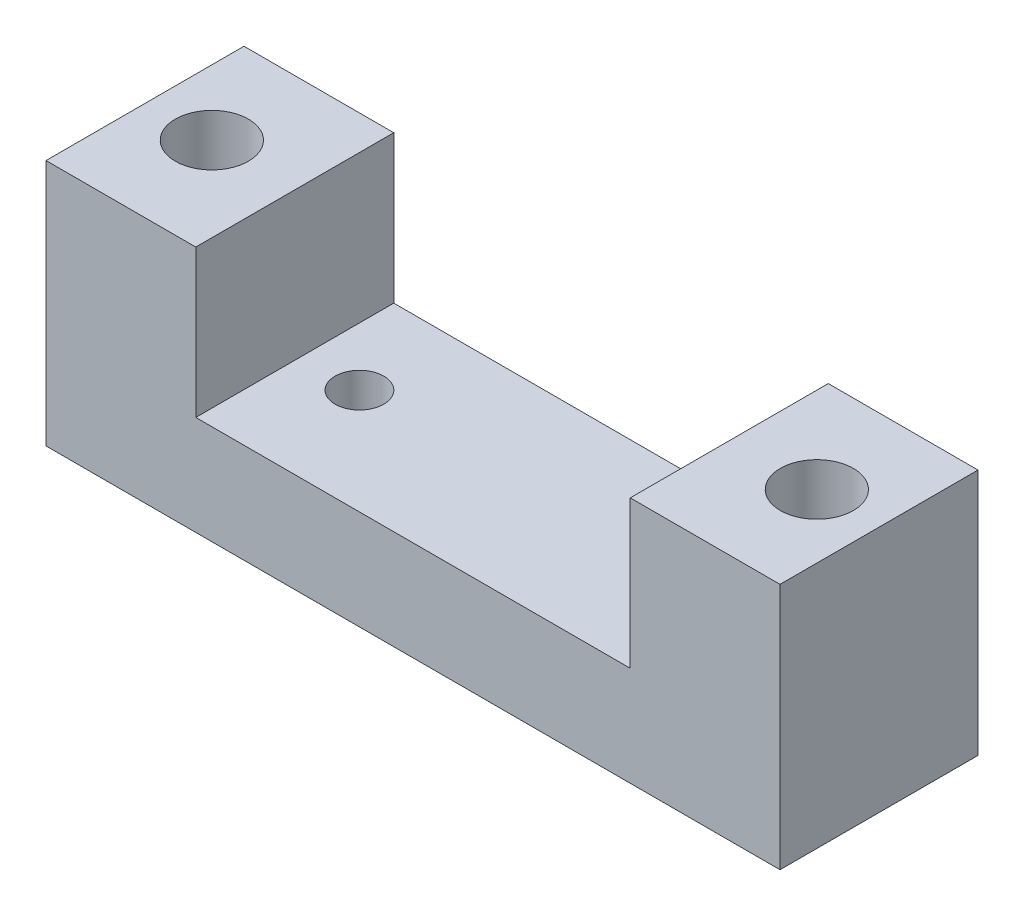
ISO-10303-21;
HEADER;
FILE_DESCRIPTION(('STEP AP214'),'2;1');
FILE_NAME('part.step','',(''),(''),'','','');
FILE_SCHEMA(('AUTOMOTIVE_DESIGN { 1 0 10303 214 1 1 1 1 }'));
ENDSEC;
DATA;
#1=APPLICATION_CONTEXT('core data for automotive mechanical design processes');
#2=APPLICATION_PROTOCOL_DEFINITION('international standard','automotive_design',2000,#1);
#3=PRODUCT_CONTEXT('',#1,'mechanical');
#4=PRODUCT('Part','Part','',(#3));
#5=PRODUCT_RELATED_PRODUCT_CATEGORY('part','',(#4));
#6=PRODUCT_DEFINITION_FORMATION('','',#4);
#7=PRODUCT_DEFINITION_CONTEXT('part definition',#1,'design');
#8=PRODUCT_DEFINITION('design','',#6,#7);
#9=PRODUCT_DEFINITION_SHAPE('','',#8);
#10=(LENGTH_UNIT() NAMED_UNIT(*) SI_UNIT(.MILLI.,.METRE.));
#11=(NAMED_UNIT(*) PLANE_ANGLE_UNIT() SI_UNIT($,.RADIAN.));
#12=(NAMED_UNIT(*) SI_UNIT($,.STERADIAN.) SOLID_ANGLE_UNIT());
#13=UNCERTAINTY_MEASURE_WITH_UNIT(LENGTH_MEASURE(1.E-05),#10,'distance_accuracy_value','');
#14=(GEOMETRIC_REPRESENTATION_CONTEXT(3) GLOBAL_UNCERTAINTY_ASSIGNED_CONTEXT((#13)) GLOBAL_UNIT_ASSIGNED_CONTEXT((#10,
#11,#12)) REPRESENTATION_CONTEXT('',''));
#15=CARTESIAN_POINT('',(0.,0.,0.));
#16=DIRECTION('',(0.,0.,1.));
#17=DIRECTION('',(1.,0.,0.));
#18=AXIS2_PLACEMENT_3D('',#15,#16,#17);
#19=CARTESIAN_POINT('',(15.07,0.,8.13));
#20=DIRECTION('',(0.,1.,0.));
#21=DIRECTION('',(0.,0.,1.));
#22=AXIS2_PLACEMENT_3D('',#19,#20,#21);
#23=PLANE('',#22);
#24=CARTESIAN_POINT('',(-6.53,0.,3.8));
#25=DIRECTION('',(0.,1.,0.));
#26=DIRECTION('',(0.,0.,1.));
#27=AXIS2_PLACEMENT_3D('',#24,#25,#26);
#28=CIRCLE('',#27,0.999999999999994);
#29=CARTESIAN_POINT('',(-6.53,0.,4.79999999999999));
#30=VERTEX_POINT('',#29);
#31=EDGE_CURVE('E219',#30,#30,#28,.T.);
#32=ORIENTED_EDGE('',*,*,#31,.T.);
#33=EDGE_LOOP('',(#32));
#34=FACE_BOUND('',#33,.T.);
#35=CARTESIAN_POINT('',(6.53,0.,3.8));
#36=DIRECTION('',(0.,1.,0.));
#37=DIRECTION('',(0.,0.,1.));
#38=AXIS2_PLACEMENT_3D('',#35,#36,#37);
#39=CIRCLE('',#38,0.999999999999994);
#40=CARTESIAN_POINT('',(6.53,0.,4.79999999999999));
#41=VERTEX_POINT('',#40);
#42=EDGE_CURVE('E36',#41,#41,#39,.T.);
#43=ORIENTED_EDGE('',*,*,#42,.T.);
#44=EDGE_LOOP('',(#43));
#45=FACE_BOUND('',#44,.T.);
#46=CARTESIAN_POINT('',(-12.39,0.,4.));
#47=DIRECTION('',(0.,1.,0.));
#48=DIRECTION('',(0.,0.,1.));
#49=AXIS2_PLACEMENT_3D('',#46,#47,#48);
#50=CIRCLE('',#49,1.49999999999999);
#51=CARTESIAN_POINT('',(-12.39,0.,5.49999999999999));
#52=VERTEX_POINT('',#51);
#53=EDGE_CURVE('E157',#52,#52,#50,.T.);
#54=ORIENTED_EDGE('',*,*,#53,.T.);
#55=EDGE_LOOP('',(#54));
#56=FACE_BOUND('',#55,.T.);
#57=CARTESIAN_POINT('',(12.452,0.,4.));
#58=DIRECTION('',(0.,1.,0.));
#59=DIRECTION('',(0.,0.,1.));
#60=AXIS2_PLACEMENT_3D('',#57,#58,#59);
#61=CIRCLE('',#60,1.49999999999999);
#62=CARTESIAN_POINT('',(12.452,0.,5.49999999999999));
#63=VERTEX_POINT('',#62);
#64=EDGE_CURVE('E135',#63,#63,#61,.T.);
#65=ORIENTED_EDGE('',*,*,#64,.T.);
#66=EDGE_LOOP('',(#65));
#67=FACE_BOUND('',#66,.T.);
#68=DIRECTION('',(1.,0.,0.));
#69=VECTOR('',#68,1.);
#70=CARTESIAN_POINT('',(15.07,0.,0.));
#71=LINE('',#70,#69);
#72=CARTESIAN_POINT('',(-15.07,0.,0.));
#73=VERTEX_POINT('',#72);
#74=CARTESIAN_POINT('',(15.07,0.,0.));
#75=VERTEX_POINT('',#74);
#76=EDGE_CURVE('E131',#73,#75,#71,.T.);
#77=ORIENTED_EDGE('',*,*,#76,.T.);
#78=DIRECTION('',(0.,0.,-1.));
#79=VECTOR('',#78,1.);
#80=CARTESIAN_POINT('',(15.07,0.,8.13));
#81=LINE('',#80,#79);
#82=CARTESIAN_POINT('',(15.07,0.,8.13));
#83=VERTEX_POINT('',#82);
#84=EDGE_CURVE('E11',#83,#75,#81,.T.);
#85=ORIENTED_EDGE('',*,*,#84,.F.);
#86=DIRECTION('',(1.,0.,0.));
#87=VECTOR('',#86,1.);
#88=CARTESIAN_POINT('',(15.07,0.,8.13));
#89=LINE('',#88,#87);
#90=CARTESIAN_POINT('',(-15.07,0.,8.13));
#91=VERTEX_POINT('',#90);
#92=EDGE_CURVE('E146',#91,#83,#89,.T.);
#93=ORIENTED_EDGE('',*,*,#92,.F.);
#94=DIRECTION('',(0.,0.,-1.));
#95=VECTOR('',#94,1.);
#96=CARTESIAN_POINT('',(-15.07,0.,8.13));
#97=LINE('',#96,#95);
#98=EDGE_CURVE('E127',#91,#73,#97,.T.);
#99=ORIENTED_EDGE('',*,*,#98,.T.);
#100=EDGE_LOOP('',(#77,#85,#93,#99));
#101=FACE_BOUND('',#100,.T.);
#102=ADVANCED_FACE('F33',(#34,#45,#56,#67,#101),#23,.F.);
#103=CARTESIAN_POINT('',(15.07,10.15,8.13));
#104=DIRECTION('',(-1.,0.,0.));
#105=DIRECTION('',(0.,0.,1.));
#106=AXIS2_PLACEMENT_3D('',#103,#104,#105);
#107=PLANE('',#106);
#108=DIRECTION('',(0.,1.,0.));
#109=VECTOR('',#108,1.);
#110=CARTESIAN_POINT('',(15.07,10.15,0.));
#111=LINE('',#110,#109);
#112=CARTESIAN_POINT('',(15.07,10.15,0.));
#113=VERTEX_POINT('',#112);
#114=EDGE_CURVE('E134',#75,#113,#111,.T.);
#115=ORIENTED_EDGE('',*,*,#114,.T.);
#116=DIRECTION('',(0.,0.,-1.));
#117=VECTOR('',#116,1.);
#118=CARTESIAN_POINT('',(15.07,10.15,8.13));
#119=LINE('',#118,#117);
#120=CARTESIAN_POINT('',(15.07,10.15,8.13));
#121=VERTEX_POINT('',#120);
#122=EDGE_CURVE('E42',#121,#113,#119,.T.);
#123=ORIENTED_EDGE('',*,*,#122,.F.);
#124=DIRECTION('',(0.,1.,0.));
#125=VECTOR('',#124,1.);
#126=CARTESIAN_POINT('',(15.07,10.15,8.13));
#127=LINE('',#126,#125);
#128=EDGE_CURVE('E94',#83,#121,#127,.T.);
#129=ORIENTED_EDGE('',*,*,#128,.F.);
#130=ORIENTED_EDGE('',*,*,#84,.T.);
#131=EDGE_LOOP('',(#115,#123,#129,#130));
#132=FACE_BOUND('',#131,.T.);
#133=ADVANCED_FACE('F210',(#132),#107,.F.);
#134=CARTESIAN_POINT('',(8.92,10.15,8.13));
#135=DIRECTION('',(0.,-1.,0.));
#136=DIRECTION('',(0.,0.,-1.));
#137=AXIS2_PLACEMENT_3D('',#134,#135,#136);
#138=PLANE('',#137);
#139=CARTESIAN_POINT('',(12.452,10.15,4.));
#140=DIRECTION('',(0.,1.,0.));
#141=DIRECTION('',(0.,0.,1.));
#142=AXIS2_PLACEMENT_3D('',#139,#140,#141);
#143=CIRCLE('',#142,1.5);
#144=CARTESIAN_POINT('',(12.452,10.15,5.5));
#145=VERTEX_POINT('',#144);
#146=EDGE_CURVE('E159',#145,#145,#143,.T.);
#147=ORIENTED_EDGE('',*,*,#146,.F.);
#148=EDGE_LOOP('',(#147));
#149=FACE_BOUND('',#148,.T.);
#150=DIRECTION('',(-1.,0.,0.));
#151=VECTOR('',#150,1.);
#152=CARTESIAN_POINT('',(8.92,10.15,0.));
#153=LINE('',#152,#151);
#154=CARTESIAN_POINT('',(8.92,10.15,0.));
#155=VERTEX_POINT('',#154);
#156=EDGE_CURVE('E137',#113,#155,#153,.T.);
#157=ORIENTED_EDGE('',*,*,#156,.T.);
#158=DIRECTION('',(0.,0.,-1.));
#159=VECTOR('',#158,1.);
#160=CARTESIAN_POINT('',(8.92,10.15,8.13));
#161=LINE('',#160,#159);
#162=CARTESIAN_POINT('',(8.92,10.15,8.13));
#163=VERTEX_POINT('',#162);
#164=EDGE_CURVE('E153',#163,#155,#161,.T.);
#165=ORIENTED_EDGE('',*,*,#164,.F.);
#166=DIRECTION('',(-1.,0.,0.));
#167=VECTOR('',#166,1.);
#168=CARTESIAN_POINT('',(8.92,10.15,8.13));
#169=LINE('',#168,#167);
#170=EDGE_CURVE('E178',#121,#163,#169,.T.);
#171=ORIENTED_EDGE('',*,*,#170,.F.);
#172=ORIENTED_EDGE('',*,*,#122,.T.);
#173=EDGE_LOOP('',(#157,#165,#171,#172));
#174=FACE_BOUND('',#173,.T.);
#175=ADVANCED_FACE('F215',(#149,#174),#138,.F.);
#176=CARTESIAN_POINT('',(8.92,4.09,8.13));
#177=DIRECTION('',(1.,0.,0.));
#178=DIRECTION('',(0.,0.,-1.));
#179=AXIS2_PLACEMENT_3D('',#176,#177,#178);
#180=PLANE('',#179);
#181=DIRECTION('',(0.,-1.,0.));
#182=VECTOR('',#181,1.);
#183=CARTESIAN_POINT('',(8.92,4.09,0.));
#184=LINE('',#183,#182);
#185=CARTESIAN_POINT('',(8.92,4.09,0.));
#186=VERTEX_POINT('',#185);
#187=EDGE_CURVE('E139',#155,#186,#184,.T.);
#188=ORIENTED_EDGE('',*,*,#187,.T.);
#189=DIRECTION('',(0.,0.,-1.));
#190=VECTOR('',#189,1.);
#191=CARTESIAN_POINT('',(8.92,4.09,8.13));
#192=LINE('',#191,#190);
#193=CARTESIAN_POINT('',(8.92,4.09,8.13));
#194=VERTEX_POINT('',#193);
#195=EDGE_CURVE('E150',#194,#186,#192,.T.);
#196=ORIENTED_EDGE('',*,*,#195,.F.);
#197=DIRECTION('',(0.,-1.,0.));
#198=VECTOR('',#197,1.);
#199=CARTESIAN_POINT('',(8.92,4.09,8.13));
#200=LINE('',#199,#198);
#201=EDGE_CURVE('E180',#163,#194,#200,.T.);
#202=ORIENTED_EDGE('',*,*,#201,.F.);
#203=ORIENTED_EDGE('',*,*,#164,.T.);
#204=EDGE_LOOP('',(#188,#196,#202,#203));
#205=FACE_BOUND('',#204,.T.);
#206=ADVANCED_FACE('F186',(#205),#180,.F.);
#207=CARTESIAN_POINT('',(-8.92,4.09,8.13));
#208=DIRECTION('',(0.,-1.,0.));
#209=DIRECTION('',(0.,0.,-1.));
#210=AXIS2_PLACEMENT_3D('',#207,#208,#209);
#211=PLANE('',#210);
#212=CARTESIAN_POINT('',(-6.53,4.09,3.8));
#213=DIRECTION('',(0.,1.,0.));
#214=DIRECTION('',(0.,0.,1.));
#215=AXIS2_PLACEMENT_3D('',#212,#213,#214);
#216=CIRCLE('',#215,0.999999999999996);
#217=CARTESIAN_POINT('',(-6.53,4.09,4.8));
#218=VERTEX_POINT('',#217);
#219=EDGE_CURVE('E247',#218,#218,#216,.T.);
#220=ORIENTED_EDGE('',*,*,#219,.F.);
#221=EDGE_LOOP('',(#220));
#222=FACE_BOUND('',#221,.T.);
#223=CARTESIAN_POINT('',(6.53,4.09,3.8));
#224=DIRECTION('',(0.,1.,0.));
#225=DIRECTION('',(0.,0.,1.));
#226=AXIS2_PLACEMENT_3D('',#223,#224,#225);
#227=CIRCLE('',#226,0.999999999999996);
#228=CARTESIAN_POINT('',(6.53,4.09,4.8));
#229=VERTEX_POINT('',#228);
#230=EDGE_CURVE('E170',#229,#229,#227,.T.);
#231=ORIENTED_EDGE('',*,*,#230,.F.);
#232=EDGE_LOOP('',(#231));
#233=FACE_BOUND('',#232,.T.);
#234=DIRECTION('',(-1.,0.,0.));
#235=VECTOR('',#234,1.);
#236=CARTESIAN_POINT('',(-8.92,4.09,0.));
#237=LINE('',#236,#235);
#238=CARTESIAN_POINT('',(-8.92,4.09,0.));
#239=VERTEX_POINT('',#238);
#240=EDGE_CURVE('E141',#186,#239,#237,.T.);
#241=ORIENTED_EDGE('',*,*,#240,.T.);
#242=DIRECTION('',(0.,0.,-1.));
#243=VECTOR('',#242,1.);
#244=CARTESIAN_POINT('',(-8.92,4.09,8.13));
#245=LINE('',#244,#243);
#246=CARTESIAN_POINT('',(-8.92,4.09,8.13));
#247=VERTEX_POINT('',#246);
#248=EDGE_CURVE('E122',#247,#239,#245,.T.);
#249=ORIENTED_EDGE('',*,*,#248,.F.);
#250=DIRECTION('',(-1.,0.,0.));
#251=VECTOR('',#250,1.);
#252=CARTESIAN_POINT('',(-8.92,4.09,8.13));
#253=LINE('',#252,#251);
#254=EDGE_CURVE('E113',#194,#247,#253,.T.);
#255=ORIENTED_EDGE('',*,*,#254,.F.);
#256=ORIENTED_EDGE('',*,*,#195,.T.);
#257=EDGE_LOOP('',(#241,#249,#255,#256));
#258=FACE_BOUND('',#257,.T.);
#259=ADVANCED_FACE('F190',(#222,#233,#258),#211,.F.);
#260=CARTESIAN_POINT('',(-8.92,10.15,8.13));
#261=DIRECTION('',(-1.,0.,0.));
#262=DIRECTION('',(0.,0.,1.));
#263=AXIS2_PLACEMENT_3D('',#260,#261,#262);
#264=PLANE('',#263);
#265=DIRECTION('',(0.,1.,0.));
#266=VECTOR('',#265,1.);
#267=CARTESIAN_POINT('',(-8.92,10.15,0.));
#268=LINE('',#267,#266);
#269=CARTESIAN_POINT('',(-8.92,10.15,0.));
#270=VERTEX_POINT('',#269);
#271=EDGE_CURVE('E121',#239,#270,#268,.T.);
#272=ORIENTED_EDGE('',*,*,#271,.T.);
#273=DIRECTION('',(0.,0.,-1.));
#274=VECTOR('',#273,1.);
#275=CARTESIAN_POINT('',(-8.92,10.15,8.13));
#276=LINE('',#275,#274);
#277=CARTESIAN_POINT('',(-8.92,10.15,8.13));
#278=VERTEX_POINT('',#277);
#279=EDGE_CURVE('E118',#278,#270,#276,.T.);
#280=ORIENTED_EDGE('',*,*,#279,.F.);
#281=DIRECTION('',(0.,1.,0.));
#282=VECTOR('',#281,1.);
#283=CARTESIAN_POINT('',(-8.92,10.15,8.13));
#284=LINE('',#283,#282);
#285=EDGE_CURVE('E107',#247,#278,#284,.T.);
#286=ORIENTED_EDGE('',*,*,#285,.F.);
#287=ORIENTED_EDGE('',*,*,#248,.T.);
#288=EDGE_LOOP('',(#272,#280,#286,#287));
#289=FACE_BOUND('',#288,.T.);
#290=ADVANCED_FACE('F119',(#289),#264,.F.);
#291=CARTESIAN_POINT('',(-15.07,10.15,8.13));
#292=DIRECTION('',(0.,-1.,0.));
#293=DIRECTION('',(0.,0.,-1.));
#294=AXIS2_PLACEMENT_3D('',#291,#292,#293);
#295=PLANE('',#294);
#296=CARTESIAN_POINT('',(-12.39,10.15,4.));
#297=DIRECTION('',(0.,1.,0.));
#298=DIRECTION('',(0.,0.,1.));
#299=AXIS2_PLACEMENT_3D('',#296,#297,#298);
#300=CIRCLE('',#299,1.5);
#301=CARTESIAN_POINT('',(-12.39,10.15,5.5));
#302=VERTEX_POINT('',#301);
#303=EDGE_CURVE('E160',#302,#302,#300,.T.);
#304=ORIENTED_EDGE('',*,*,#303,.F.);
#305=EDGE_LOOP('',(#304));
#306=FACE_BOUND('',#305,.T.);
#307=DIRECTION('',(-1.,0.,0.));
#308=VECTOR('',#307,1.);
#309=CARTESIAN_POINT('',(-15.07,10.15,0.));
#310=LINE('',#309,#308);
#311=CARTESIAN_POINT('',(-15.07,10.15,0.));
#312=VERTEX_POINT('',#311);
#313=EDGE_CURVE('E80',#270,#312,#310,.T.);
#314=ORIENTED_EDGE('',*,*,#313,.T.);
#315=DIRECTION('',(0.,0.,-1.));
#316=VECTOR('',#315,1.);
#317=CARTESIAN_POINT('',(-15.07,10.15,8.13));
#318=LINE('',#317,#316);
#319=CARTESIAN_POINT('',(-15.07,10.15,8.13));
#320=VERTEX_POINT('',#319);
#321=EDGE_CURVE('E123',#320,#312,#318,.T.);
#322=ORIENTED_EDGE('',*,*,#321,.F.);
#323=DIRECTION('',(-1.,0.,0.));
#324=VECTOR('',#323,1.);
#325=CARTESIAN_POINT('',(-15.07,10.15,8.13));
#326=LINE('',#325,#324);
#327=EDGE_CURVE('E111',#278,#320,#326,.T.);
#328=ORIENTED_EDGE('',*,*,#327,.F.);
#329=ORIENTED_EDGE('',*,*,#279,.T.);
#330=EDGE_LOOP('',(#314,#322,#328,#329));
#331=FACE_BOUND('',#330,.T.);
#332=ADVANCED_FACE('F125',(#306,#331),#295,.F.);
#333=CARTESIAN_POINT('',(-15.07,0.,8.13));
#334=DIRECTION('',(1.,0.,0.));
#335=DIRECTION('',(0.,0.,-1.));
#336=AXIS2_PLACEMENT_3D('',#333,#334,#335);
#337=PLANE('',#336);
#338=DIRECTION('',(0.,-1.,0.));
#339=VECTOR('',#338,1.);
#340=CARTESIAN_POINT('',(-15.07,0.,0.));
#341=LINE('',#340,#339);
#342=EDGE_CURVE('E86',#312,#73,#341,.T.);
#343=ORIENTED_EDGE('',*,*,#342,.T.);
#344=ORIENTED_EDGE('',*,*,#98,.F.);
#345=DIRECTION('',(0.,-1.,0.));
#346=VECTOR('',#345,1.);
#347=CARTESIAN_POINT('',(-15.07,0.,8.13));
#348=LINE('',#347,#346);
#349=EDGE_CURVE('E51',#320,#91,#348,.T.);
#350=ORIENTED_EDGE('',*,*,#349,.F.);
#351=ORIENTED_EDGE('',*,*,#321,.T.);
#352=EDGE_LOOP('',(#343,#344,#350,#351));
#353=FACE_BOUND('',#352,.T.);
#354=ADVANCED_FACE('F198',(#353),#337,.F.);
#355=CARTESIAN_POINT('',(0.,0.,8.13));
#356=DIRECTION('',(0.,0.,-1.));
#357=DIRECTION('',(-1.,0.,0.));
#358=AXIS2_PLACEMENT_3D('',#355,#356,#357);
#359=PLANE('',#358);
#360=ORIENTED_EDGE('',*,*,#92,.T.);
#361=ORIENTED_EDGE('',*,*,#128,.T.);
#362=ORIENTED_EDGE('',*,*,#170,.T.);
#363=ORIENTED_EDGE('',*,*,#201,.T.);
#364=ORIENTED_EDGE('',*,*,#254,.T.);
#365=ORIENTED_EDGE('',*,*,#285,.T.);
#366=ORIENTED_EDGE('',*,*,#327,.T.);
#367=ORIENTED_EDGE('',*,*,#349,.T.);
#368=EDGE_LOOP('',(#360,#361,#362,#363,#364,#365,#366,#367));
#369=FACE_BOUND('',#368,.T.);
#370=ADVANCED_FACE('F109',(#369),#359,.F.);
#371=CARTESIAN_POINT('',(0.,0.,0.));
#372=DIRECTION('',(0.,0.,-1.));
#373=DIRECTION('',(-1.,0.,0.));
#374=AXIS2_PLACEMENT_3D('',#371,#372,#373);
#375=PLANE('',#374);
#376=ORIENTED_EDGE('',*,*,#76,.F.);
#377=ORIENTED_EDGE('',*,*,#342,.F.);
#378=ORIENTED_EDGE('',*,*,#313,.F.);
#379=ORIENTED_EDGE('',*,*,#271,.F.);
#380=ORIENTED_EDGE('',*,*,#240,.F.);
#381=ORIENTED_EDGE('',*,*,#187,.F.);
#382=ORIENTED_EDGE('',*,*,#156,.F.);
#383=ORIENTED_EDGE('',*,*,#114,.F.);
#384=EDGE_LOOP('',(#376,#377,#378,#379,#380,#381,#382,#383));
#385=FACE_BOUND('',#384,.T.);
#386=ADVANCED_FACE('F193',(#385),#375,.T.);
#387=CARTESIAN_POINT('',(12.452,10.15,4.));
#388=DIRECTION('',(0.,1.,0.));
#389=DIRECTION('',(0.,0.,1.));
#390=AXIS2_PLACEMENT_3D('',#387,#388,#389);
#391=CYLINDRICAL_SURFACE('',#390,1.49999999999999);
#392=ORIENTED_EDGE('',*,*,#146,.T.);
#393=EDGE_LOOP('',(#392));
#394=FACE_BOUND('',#393,.T.);
#395=ORIENTED_EDGE('',*,*,#64,.F.);
#396=EDGE_LOOP('',(#395));
#397=FACE_BOUND('',#396,.T.);
#398=ADVANCED_FACE('F224',(#394,#397),#391,.F.);
#399=CARTESIAN_POINT('',(-12.39,10.15,4.));
#400=DIRECTION('',(0.,1.,0.));
#401=DIRECTION('',(0.,0.,1.));
#402=AXIS2_PLACEMENT_3D('',#399,#400,#401);
#403=CYLINDRICAL_SURFACE('',#402,1.49999999999999);
#404=ORIENTED_EDGE('',*,*,#303,.T.);
#405=EDGE_LOOP('',(#404));
#406=FACE_BOUND('',#405,.T.);
#407=ORIENTED_EDGE('',*,*,#53,.F.);
#408=EDGE_LOOP('',(#407));
#409=FACE_BOUND('',#408,.T.);
#410=ADVANCED_FACE('F226',(#406,#409),#403,.F.);
#411=CARTESIAN_POINT('',(6.53,4.09,3.8));
#412=DIRECTION('',(0.,1.,0.));
#413=DIRECTION('',(0.,0.,1.));
#414=AXIS2_PLACEMENT_3D('',#411,#412,#413);
#415=CYLINDRICAL_SURFACE('',#414,0.999999999999994);
#416=ORIENTED_EDGE('',*,*,#230,.T.);
#417=EDGE_LOOP('',(#416));
#418=FACE_BOUND('',#417,.T.);
#419=ORIENTED_EDGE('',*,*,#42,.F.);
#420=EDGE_LOOP('',(#419));
#421=FACE_BOUND('',#420,.T.);
#422=ADVANCED_FACE('F233',(#418,#421),#415,.F.);
#423=CARTESIAN_POINT('',(-6.53,4.09,3.8));
#424=DIRECTION('',(0.,1.,0.));
#425=DIRECTION('',(0.,0.,1.));
#426=AXIS2_PLACEMENT_3D('',#423,#424,#425);
#427=CYLINDRICAL_SURFACE('',#426,0.999999999999994);
#428=ORIENTED_EDGE('',*,*,#219,.T.);
#429=EDGE_LOOP('',(#428));
#430=FACE_BOUND('',#429,.T.);
#431=ORIENTED_EDGE('',*,*,#31,.F.);
#432=EDGE_LOOP('',(#431));
#433=FACE_BOUND('',#432,.T.);
#434=ADVANCED_FACE('F238',(#430,#433),#427,.F.);
#435=CLOSED_SHELL('',(#102,#133,#175,#206,#259,#290,#332,#354,#370,#386,#398,#410,#422,#434));
#436=MANIFOLD_SOLID_BREP('B2',#435);
#437=ADVANCED_BREP_SHAPE_REPRESENTATION('',(#18,#436),#14);
#438=SHAPE_DEFINITION_REPRESENTATION(#9,#437);
ENDSEC;
END-ISO-10303-21;
